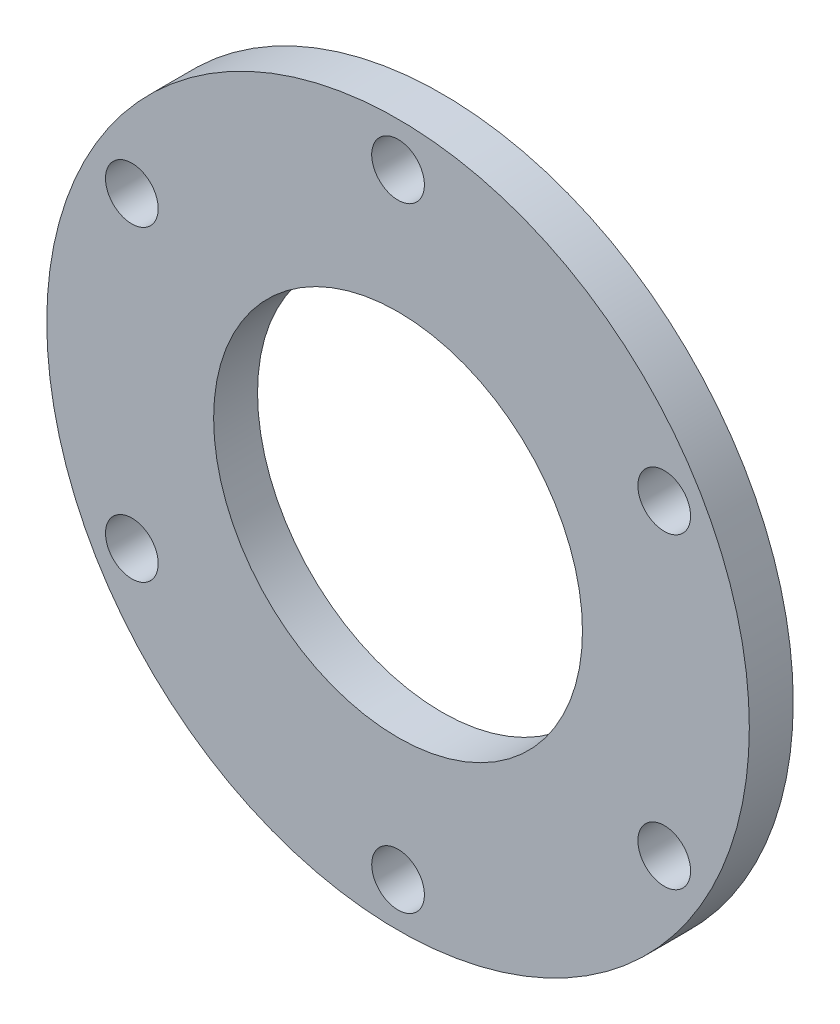
ISO-10303-21;
HEADER;
FILE_DESCRIPTION(('STEP AP214'),'2;1');
FILE_NAME('part.step','',(''),(''),'','','');
FILE_SCHEMA(('AUTOMOTIVE_DESIGN { 1 0 10303 214 1 1 1 1 }'));
ENDSEC;
DATA;
#1=APPLICATION_CONTEXT('core data for automotive mechanical design processes');
#2=APPLICATION_PROTOCOL_DEFINITION('international standard','automotive_design',2000,#1);
#3=PRODUCT_CONTEXT('',#1,'mechanical');
#4=PRODUCT('Part','Part','',(#3));
#5=PRODUCT_RELATED_PRODUCT_CATEGORY('part','',(#4));
#6=PRODUCT_DEFINITION_FORMATION('','',#4);
#7=PRODUCT_DEFINITION_CONTEXT('part definition',#1,'design');
#8=PRODUCT_DEFINITION('design','',#6,#7);
#9=PRODUCT_DEFINITION_SHAPE('','',#8);
#10=(LENGTH_UNIT() NAMED_UNIT(*) SI_UNIT(.MILLI.,.METRE.));
#11=(NAMED_UNIT(*) PLANE_ANGLE_UNIT() SI_UNIT($,.RADIAN.));
#12=(NAMED_UNIT(*) SI_UNIT($,.STERADIAN.) SOLID_ANGLE_UNIT());
#13=UNCERTAINTY_MEASURE_WITH_UNIT(LENGTH_MEASURE(1.E-05),#10,'distance_accuracy_value','');
#14=(GEOMETRIC_REPRESENTATION_CONTEXT(3) GLOBAL_UNCERTAINTY_ASSIGNED_CONTEXT((#13)) GLOBAL_UNIT_ASSIGNED_CONTEXT((#10,
#11,#12)) REPRESENTATION_CONTEXT('',''));
#15=CARTESIAN_POINT('',(0.,0.,0.));
#16=DIRECTION('',(0.,0.,1.));
#17=DIRECTION('',(1.,0.,0.));
#18=AXIS2_PLACEMENT_3D('',#15,#16,#17);
#19=CARTESIAN_POINT('',(0.,0.,3.175));
#20=DIRECTION('',(0.,0.,1.));
#21=DIRECTION('',(1.,0.,0.));
#22=AXIS2_PLACEMENT_3D('',#19,#20,#21);
#23=PLANE('',#22);
#24=CARTESIAN_POINT('',(19.247414599109,11.1125000000002,3.175));
#25=DIRECTION('',(0.,0.,1.));
#26=DIRECTION('',(0.50000000000001,-0.866025403784433,0.));
#27=AXIS2_PLACEMENT_3D('',#24,#25,#26);
#28=CIRCLE('',#27,1.905);
#29=CARTESIAN_POINT('',(20.199914599109,9.46272160579088,3.175));
#30=VERTEX_POINT('',#29);
#31=EDGE_CURVE('E81',#30,#30,#28,.T.);
#32=ORIENTED_EDGE('',*,*,#31,.F.);
#33=EDGE_LOOP('',(#32));
#34=FACE_BOUND('',#33,.T.);
#35=CARTESIAN_POINT('',(19.2474145991092,-11.1124999999998,3.175));
#36=DIRECTION('',(0.,0.,1.));
#37=DIRECTION('',(-0.499999999999992,-0.866025403784443,0.));
#38=AXIS2_PLACEMENT_3D('',#35,#36,#37);
#39=CIRCLE('',#38,1.905);
#40=CARTESIAN_POINT('',(18.2949145991093,-12.7622783942092,3.175));
#41=VERTEX_POINT('',#40);
#42=EDGE_CURVE('E75',#41,#41,#39,.T.);
#43=ORIENTED_EDGE('',*,*,#42,.F.);
#44=EDGE_LOOP('',(#43));
#45=FACE_BOUND('',#44,.T.);
#46=CARTESIAN_POINT('',(0.,-22.225,3.175));
#47=DIRECTION('',(0.,0.,1.));
#48=DIRECTION('',(-1.,0.,0.));
#49=AXIS2_PLACEMENT_3D('',#46,#47,#48);
#50=CIRCLE('',#49,1.905);
#51=CARTESIAN_POINT('',(-1.905,-22.225,3.175));
#52=VERTEX_POINT('',#51);
#53=EDGE_CURVE('E69',#52,#52,#50,.T.);
#54=ORIENTED_EDGE('',*,*,#53,.F.);
#55=EDGE_LOOP('',(#54));
#56=FACE_BOUND('',#55,.T.);
#57=CARTESIAN_POINT('',(-19.2474145991091,-11.1125000000001,3.175));
#58=DIRECTION('',(0.,0.,1.));
#59=DIRECTION('',(-0.500000000000004,0.866025403784436,0.));
#60=AXIS2_PLACEMENT_3D('',#57,#58,#59);
#61=CIRCLE('',#60,1.905);
#62=CARTESIAN_POINT('',(-20.1999145991091,-9.46272160579074,3.175));
#63=VERTEX_POINT('',#62);
#64=EDGE_CURVE('E63',#63,#63,#61,.T.);
#65=ORIENTED_EDGE('',*,*,#64,.F.);
#66=EDGE_LOOP('',(#65));
#67=FACE_BOUND('',#66,.T.);
#68=CARTESIAN_POINT('',(-19.2474145991092,11.1125,3.175));
#69=DIRECTION('',(0.,0.,1.));
#70=DIRECTION('',(0.499999999999998,0.86602540378444,0.));
#71=AXIS2_PLACEMENT_3D('',#68,#69,#70);
#72=CIRCLE('',#71,1.905);
#73=CARTESIAN_POINT('',(-18.2949145991092,12.7622783942093,3.175));
#74=VERTEX_POINT('',#73);
#75=EDGE_CURVE('E57',#74,#74,#72,.T.);
#76=ORIENTED_EDGE('',*,*,#75,.F.);
#77=EDGE_LOOP('',(#76));
#78=FACE_BOUND('',#77,.T.);
#79=CARTESIAN_POINT('',(0.,22.225,3.175));
#80=DIRECTION('',(0.,0.,1.));
#81=DIRECTION('',(1.,0.,0.));
#82=AXIS2_PLACEMENT_3D('',#79,#80,#81);
#83=CIRCLE('',#82,1.905);
#84=CARTESIAN_POINT('',(1.905,22.225,3.175));
#85=VERTEX_POINT('',#84);
#86=EDGE_CURVE('E51',#85,#85,#83,.T.);
#87=ORIENTED_EDGE('',*,*,#86,.F.);
#88=EDGE_LOOP('',(#87));
#89=FACE_BOUND('',#88,.T.);
#90=CARTESIAN_POINT('',(0.,0.,3.175));
#91=DIRECTION('',(0.,0.,1.));
#92=DIRECTION('',(1.,0.,0.));
#93=AXIS2_PLACEMENT_3D('',#90,#91,#92);
#94=CIRCLE('',#93,25.4);
#95=CARTESIAN_POINT('',(25.4,0.,3.175));
#96=VERTEX_POINT('',#95);
#97=EDGE_CURVE('E10',#96,#96,#94,.T.);
#98=ORIENTED_EDGE('',*,*,#97,.T.);
#99=EDGE_LOOP('',(#98));
#100=FACE_BOUND('',#99,.T.);
#101=CARTESIAN_POINT('',(0.,0.,3.175));
#102=DIRECTION('',(0.,0.,1.));
#103=DIRECTION('',(1.,0.,0.));
#104=AXIS2_PLACEMENT_3D('',#101,#102,#103);
#105=CIRCLE('',#104,13.335);
#106=CARTESIAN_POINT('',(13.335,0.,3.175));
#107=VERTEX_POINT('',#106);
#108=EDGE_CURVE('E43',#107,#107,#105,.T.);
#109=ORIENTED_EDGE('',*,*,#108,.F.);
#110=EDGE_LOOP('',(#109));
#111=FACE_BOUND('',#110,.T.);
#112=ADVANCED_FACE('F32',(#34,#45,#56,#67,#78,#89,#100,#111),#23,.T.);
#113=CARTESIAN_POINT('',(0.,0.,0.));
#114=DIRECTION('',(0.,0.,1.));
#115=DIRECTION('',(1.,0.,0.));
#116=AXIS2_PLACEMENT_3D('',#113,#114,#115);
#117=PLANE('',#116);
#118=CARTESIAN_POINT('',(19.247414599109,11.1125000000002,0.));
#119=DIRECTION('',(0.,0.,1.));
#120=DIRECTION('',(0.50000000000001,-0.866025403784433,0.));
#121=AXIS2_PLACEMENT_3D('',#118,#119,#120);
#122=CIRCLE('',#121,1.905);
#123=CARTESIAN_POINT('',(20.199914599109,9.46272160579088,0.));
#124=VERTEX_POINT('',#123);
#125=EDGE_CURVE('E78',#124,#124,#122,.T.);
#126=ORIENTED_EDGE('',*,*,#125,.T.);
#127=EDGE_LOOP('',(#126));
#128=FACE_BOUND('',#127,.T.);
#129=CARTESIAN_POINT('',(19.2474145991092,-11.1124999999998,0.));
#130=DIRECTION('',(0.,0.,1.));
#131=DIRECTION('',(-0.499999999999992,-0.866025403784443,0.));
#132=AXIS2_PLACEMENT_3D('',#129,#130,#131);
#133=CIRCLE('',#132,1.905);
#134=CARTESIAN_POINT('',(18.2949145991093,-12.7622783942092,0.));
#135=VERTEX_POINT('',#134);
#136=EDGE_CURVE('E72',#135,#135,#133,.T.);
#137=ORIENTED_EDGE('',*,*,#136,.T.);
#138=EDGE_LOOP('',(#137));
#139=FACE_BOUND('',#138,.T.);
#140=CARTESIAN_POINT('',(0.,-22.225,0.));
#141=DIRECTION('',(0.,0.,1.));
#142=DIRECTION('',(-1.,0.,0.));
#143=AXIS2_PLACEMENT_3D('',#140,#141,#142);
#144=CIRCLE('',#143,1.905);
#145=CARTESIAN_POINT('',(-1.905,-22.225,0.));
#146=VERTEX_POINT('',#145);
#147=EDGE_CURVE('E66',#146,#146,#144,.T.);
#148=ORIENTED_EDGE('',*,*,#147,.T.);
#149=EDGE_LOOP('',(#148));
#150=FACE_BOUND('',#149,.T.);
#151=CARTESIAN_POINT('',(-19.2474145991091,-11.1125000000001,0.));
#152=DIRECTION('',(0.,0.,1.));
#153=DIRECTION('',(-0.500000000000004,0.866025403784436,0.));
#154=AXIS2_PLACEMENT_3D('',#151,#152,#153);
#155=CIRCLE('',#154,1.905);
#156=CARTESIAN_POINT('',(-20.1999145991091,-9.46272160579074,0.));
#157=VERTEX_POINT('',#156);
#158=EDGE_CURVE('E60',#157,#157,#155,.T.);
#159=ORIENTED_EDGE('',*,*,#158,.T.);
#160=EDGE_LOOP('',(#159));
#161=FACE_BOUND('',#160,.T.);
#162=CARTESIAN_POINT('',(-19.2474145991092,11.1125,0.));
#163=DIRECTION('',(0.,0.,1.));
#164=DIRECTION('',(0.499999999999998,0.86602540378444,0.));
#165=AXIS2_PLACEMENT_3D('',#162,#163,#164);
#166=CIRCLE('',#165,1.905);
#167=CARTESIAN_POINT('',(-18.2949145991092,12.7622783942093,0.));
#168=VERTEX_POINT('',#167);
#169=EDGE_CURVE('E54',#168,#168,#166,.T.);
#170=ORIENTED_EDGE('',*,*,#169,.T.);
#171=EDGE_LOOP('',(#170));
#172=FACE_BOUND('',#171,.T.);
#173=CARTESIAN_POINT('',(0.,22.225,0.));
#174=DIRECTION('',(0.,0.,1.));
#175=DIRECTION('',(1.,0.,0.));
#176=AXIS2_PLACEMENT_3D('',#173,#174,#175);
#177=CIRCLE('',#176,1.905);
#178=CARTESIAN_POINT('',(1.905,22.225,0.));
#179=VERTEX_POINT('',#178);
#180=EDGE_CURVE('E48',#179,#179,#177,.T.);
#181=ORIENTED_EDGE('',*,*,#180,.T.);
#182=EDGE_LOOP('',(#181));
#183=FACE_BOUND('',#182,.T.);
#184=CARTESIAN_POINT('',(0.,0.,0.));
#185=DIRECTION('',(0.,0.,1.));
#186=DIRECTION('',(1.,0.,0.));
#187=AXIS2_PLACEMENT_3D('',#184,#185,#186);
#188=CIRCLE('',#187,25.4);
#189=CARTESIAN_POINT('',(25.4,0.,0.));
#190=VERTEX_POINT('',#189);
#191=EDGE_CURVE('E36',#190,#190,#188,.T.);
#192=ORIENTED_EDGE('',*,*,#191,.F.);
#193=EDGE_LOOP('',(#192));
#194=FACE_BOUND('',#193,.T.);
#195=CARTESIAN_POINT('',(0.,0.,0.));
#196=DIRECTION('',(0.,0.,1.));
#197=DIRECTION('',(1.,0.,0.));
#198=AXIS2_PLACEMENT_3D('',#195,#196,#197);
#199=CIRCLE('',#198,13.335);
#200=CARTESIAN_POINT('',(13.335,0.,0.));
#201=VERTEX_POINT('',#200);
#202=EDGE_CURVE('E45',#201,#201,#199,.T.);
#203=ORIENTED_EDGE('',*,*,#202,.T.);
#204=EDGE_LOOP('',(#203));
#205=FACE_BOUND('',#204,.T.);
#206=ADVANCED_FACE('F87',(#128,#139,#150,#161,#172,#183,#194,#205),#117,.F.);
#207=CARTESIAN_POINT('',(0.,0.,3.175));
#208=DIRECTION('',(0.,0.,-1.));
#209=DIRECTION('',(-1.,0.,0.));
#210=AXIS2_PLACEMENT_3D('',#207,#208,#209);
#211=CYLINDRICAL_SURFACE('',#210,25.4);
#212=ORIENTED_EDGE('',*,*,#97,.F.);
#213=EDGE_LOOP('',(#212));
#214=FACE_BOUND('',#213,.T.);
#215=ORIENTED_EDGE('',*,*,#191,.T.);
#216=EDGE_LOOP('',(#215));
#217=FACE_BOUND('',#216,.T.);
#218=ADVANCED_FACE('F34',(#214,#217),#211,.T.);
#219=CARTESIAN_POINT('',(0.,0.,3.175));
#220=DIRECTION('',(0.,0.,-1.));
#221=DIRECTION('',(-1.,0.,0.));
#222=AXIS2_PLACEMENT_3D('',#219,#220,#221);
#223=CYLINDRICAL_SURFACE('',#222,13.335);
#224=ORIENTED_EDGE('',*,*,#108,.T.);
#225=EDGE_LOOP('',(#224));
#226=FACE_BOUND('',#225,.T.);
#227=ORIENTED_EDGE('',*,*,#202,.F.);
#228=EDGE_LOOP('',(#227));
#229=FACE_BOUND('',#228,.T.);
#230=ADVANCED_FACE('F112',(#226,#229),#223,.F.);
#231=CARTESIAN_POINT('',(0.,22.225,0.));
#232=DIRECTION('',(0.,0.,1.));
#233=DIRECTION('',(1.,0.,0.));
#234=AXIS2_PLACEMENT_3D('',#231,#232,#233);
#235=CYLINDRICAL_SURFACE('',#234,1.905);
#236=ORIENTED_EDGE('',*,*,#180,.F.);
#237=EDGE_LOOP('',(#236));
#238=FACE_BOUND('',#237,.T.);
#239=ORIENTED_EDGE('',*,*,#86,.T.);
#240=EDGE_LOOP('',(#239));
#241=FACE_BOUND('',#240,.T.);
#242=ADVANCED_FACE('F115',(#238,#241),#235,.F.);
#243=CARTESIAN_POINT('',(-19.2474145991092,11.1125,0.));
#244=DIRECTION('',(0.,0.,1.));
#245=DIRECTION('',(1.,0.,0.));
#246=AXIS2_PLACEMENT_3D('',#243,#244,#245);
#247=CYLINDRICAL_SURFACE('',#246,1.905);
#248=ORIENTED_EDGE('',*,*,#169,.F.);
#249=EDGE_LOOP('',(#248));
#250=FACE_BOUND('',#249,.T.);
#251=ORIENTED_EDGE('',*,*,#75,.T.);
#252=EDGE_LOOP('',(#251));
#253=FACE_BOUND('',#252,.T.);
#254=ADVANCED_FACE('F127',(#250,#253),#247,.F.);
#255=CARTESIAN_POINT('',(-19.2474145991091,-11.1125000000001,0.));
#256=DIRECTION('',(0.,0.,1.));
#257=DIRECTION('',(1.,0.,0.));
#258=AXIS2_PLACEMENT_3D('',#255,#256,#257);
#259=CYLINDRICAL_SURFACE('',#258,1.905);
#260=ORIENTED_EDGE('',*,*,#158,.F.);
#261=EDGE_LOOP('',(#260));
#262=FACE_BOUND('',#261,.T.);
#263=ORIENTED_EDGE('',*,*,#64,.T.);
#264=EDGE_LOOP('',(#263));
#265=FACE_BOUND('',#264,.T.);
#266=ADVANCED_FACE('F131',(#262,#265),#259,.F.);
#267=CARTESIAN_POINT('',(0.,-22.225,0.));
#268=DIRECTION('',(0.,0.,1.));
#269=DIRECTION('',(1.,0.,0.));
#270=AXIS2_PLACEMENT_3D('',#267,#268,#269);
#271=CYLINDRICAL_SURFACE('',#270,1.905);
#272=ORIENTED_EDGE('',*,*,#147,.F.);
#273=EDGE_LOOP('',(#272));
#274=FACE_BOUND('',#273,.T.);
#275=ORIENTED_EDGE('',*,*,#53,.T.);
#276=EDGE_LOOP('',(#275));
#277=FACE_BOUND('',#276,.T.);
#278=ADVANCED_FACE('F135',(#274,#277),#271,.F.);
#279=CARTESIAN_POINT('',(19.2474145991092,-11.1124999999998,0.));
#280=DIRECTION('',(0.,0.,1.));
#281=DIRECTION('',(1.,0.,0.));
#282=AXIS2_PLACEMENT_3D('',#279,#280,#281);
#283=CYLINDRICAL_SURFACE('',#282,1.905);
#284=ORIENTED_EDGE('',*,*,#136,.F.);
#285=EDGE_LOOP('',(#284));
#286=FACE_BOUND('',#285,.T.);
#287=ORIENTED_EDGE('',*,*,#42,.T.);
#288=EDGE_LOOP('',(#287));
#289=FACE_BOUND('',#288,.T.);
#290=ADVANCED_FACE('F93',(#286,#289),#283,.F.);
#291=CARTESIAN_POINT('',(19.247414599109,11.1125000000002,0.));
#292=DIRECTION('',(0.,0.,1.));
#293=DIRECTION('',(1.,0.,0.));
#294=AXIS2_PLACEMENT_3D('',#291,#292,#293);
#295=CYLINDRICAL_SURFACE('',#294,1.905);
#296=ORIENTED_EDGE('',*,*,#125,.F.);
#297=EDGE_LOOP('',(#296));
#298=FACE_BOUND('',#297,.T.);
#299=ORIENTED_EDGE('',*,*,#31,.T.);
#300=EDGE_LOOP('',(#299));
#301=FACE_BOUND('',#300,.T.);
#302=ADVANCED_FACE('F90',(#298,#301),#295,.F.);
#303=CLOSED_SHELL('',(#112,#206,#218,#230,#242,#254,#266,#278,#290,#302));
#304=MANIFOLD_SOLID_BREP('B2',#303);
#305=ADVANCED_BREP_SHAPE_REPRESENTATION('',(#18,#304),#14);
#306=SHAPE_DEFINITION_REPRESENTATION(#9,#305);
ENDSEC;
END-ISO-10303-21;
